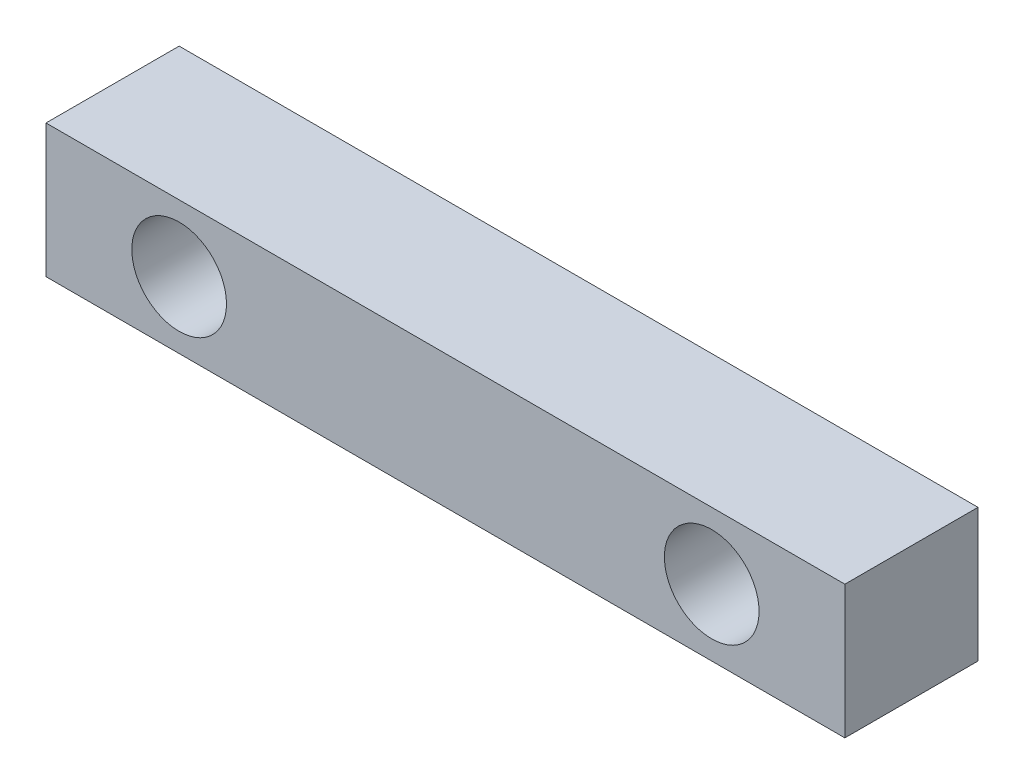
ISO-10303-21;
HEADER;
FILE_DESCRIPTION(('STEP AP214'),'2;1');
FILE_NAME('part.step','',(''),(''),'','','');
FILE_SCHEMA(('AUTOMOTIVE_DESIGN { 1 0 10303 214 1 1 1 1 }'));
ENDSEC;
DATA;
#1=APPLICATION_CONTEXT('core data for automotive mechanical design processes');
#2=APPLICATION_PROTOCOL_DEFINITION('international standard','automotive_design',2000,#1);
#3=PRODUCT_CONTEXT('',#1,'mechanical');
#4=PRODUCT('Part','Part','',(#3));
#5=PRODUCT_RELATED_PRODUCT_CATEGORY('part','',(#4));
#6=PRODUCT_DEFINITION_FORMATION('','',#4);
#7=PRODUCT_DEFINITION_CONTEXT('part definition',#1,'design');
#8=PRODUCT_DEFINITION('design','',#6,#7);
#9=PRODUCT_DEFINITION_SHAPE('','',#8);
#10=(LENGTH_UNIT() NAMED_UNIT(*) SI_UNIT(.MILLI.,.METRE.));
#11=(NAMED_UNIT(*) PLANE_ANGLE_UNIT() SI_UNIT($,.RADIAN.));
#12=(NAMED_UNIT(*) SI_UNIT($,.STERADIAN.) SOLID_ANGLE_UNIT());
#13=UNCERTAINTY_MEASURE_WITH_UNIT(LENGTH_MEASURE(1.E-05),#10,'distance_accuracy_value','');
#14=(GEOMETRIC_REPRESENTATION_CONTEXT(3) GLOBAL_UNCERTAINTY_ASSIGNED_CONTEXT((#13)) GLOBAL_UNIT_ASSIGNED_CONTEXT((#10,
#11,#12)) REPRESENTATION_CONTEXT('',''));
#15=CARTESIAN_POINT('',(0.,0.,0.));
#16=DIRECTION('',(0.,0.,1.));
#17=DIRECTION('',(1.,0.,0.));
#18=AXIS2_PLACEMENT_3D('',#15,#16,#17);
#19=CARTESIAN_POINT('',(-15.,2.5,5.));
#20=DIRECTION('',(1.,0.,0.));
#21=DIRECTION('',(0.,0.,-1.));
#22=AXIS2_PLACEMENT_3D('',#19,#20,#21);
#23=PLANE('',#22);
#24=DIRECTION('',(0.,-1.,0.));
#25=VECTOR('',#24,1.);
#26=CARTESIAN_POINT('',(-15.,2.5,0.));
#27=LINE('',#26,#25);
#28=CARTESIAN_POINT('',(-15.,2.5,0.));
#29=VERTEX_POINT('',#28);
#30=CARTESIAN_POINT('',(-15.,-2.5,0.));
#31=VERTEX_POINT('',#30);
#32=EDGE_CURVE('E107',#29,#31,#27,.T.);
#33=ORIENTED_EDGE('',*,*,#32,.T.);
#34=DIRECTION('',(0.,0.,-1.));
#35=VECTOR('',#34,1.);
#36=CARTESIAN_POINT('',(-15.,-2.5,5.));
#37=LINE('',#36,#35);
#38=CARTESIAN_POINT('',(-15.,-2.5,5.));
#39=VERTEX_POINT('',#38);
#40=EDGE_CURVE('E11',#39,#31,#37,.T.);
#41=ORIENTED_EDGE('',*,*,#40,.F.);
#42=DIRECTION('',(0.,-1.,0.));
#43=VECTOR('',#42,1.);
#44=CARTESIAN_POINT('',(-15.,2.5,5.));
#45=LINE('',#44,#43);
#46=CARTESIAN_POINT('',(-15.,2.5,5.));
#47=VERTEX_POINT('',#46);
#48=EDGE_CURVE('E91',#47,#39,#45,.T.);
#49=ORIENTED_EDGE('',*,*,#48,.F.);
#50=DIRECTION('',(0.,0.,-1.));
#51=VECTOR('',#50,1.);
#52=CARTESIAN_POINT('',(-15.,2.5,5.));
#53=LINE('',#52,#51);
#54=EDGE_CURVE('E103',#47,#29,#53,.T.);
#55=ORIENTED_EDGE('',*,*,#54,.T.);
#56=EDGE_LOOP('',(#33,#41,#49,#55));
#57=FACE_BOUND('',#56,.T.);
#58=ADVANCED_FACE('F39',(#57),#23,.F.);
#59=CARTESIAN_POINT('',(-15.,-2.5,5.));
#60=DIRECTION('',(0.,1.,0.));
#61=DIRECTION('',(-1.,0.,0.));
#62=AXIS2_PLACEMENT_3D('',#59,#60,#61);
#63=PLANE('',#62);
#64=DIRECTION('',(1.,0.,0.));
#65=VECTOR('',#64,1.);
#66=CARTESIAN_POINT('',(-15.,-2.5,0.));
#67=LINE('',#66,#65);
#68=CARTESIAN_POINT('',(15.,-2.50000000000001,0.));
#69=VERTEX_POINT('',#68);
#70=EDGE_CURVE('E96',#31,#69,#67,.T.);
#71=ORIENTED_EDGE('',*,*,#70,.T.);
#72=DIRECTION('',(0.,0.,-1.));
#73=VECTOR('',#72,1.);
#74=CARTESIAN_POINT('',(15.,-2.50000000000001,5.));
#75=LINE('',#74,#73);
#76=CARTESIAN_POINT('',(15.,-2.50000000000001,5.));
#77=VERTEX_POINT('',#76);
#78=EDGE_CURVE('E48',#77,#69,#75,.T.);
#79=ORIENTED_EDGE('',*,*,#78,.F.);
#80=DIRECTION('',(1.,0.,0.));
#81=VECTOR('',#80,1.);
#82=CARTESIAN_POINT('',(-15.,-2.5,5.));
#83=LINE('',#82,#81);
#84=EDGE_CURVE('E86',#39,#77,#83,.T.);
#85=ORIENTED_EDGE('',*,*,#84,.F.);
#86=ORIENTED_EDGE('',*,*,#40,.T.);
#87=EDGE_LOOP('',(#71,#79,#85,#86));
#88=FACE_BOUND('',#87,.T.);
#89=ADVANCED_FACE('F95',(#88),#63,.F.);
#90=CARTESIAN_POINT('',(15.,2.50000000000001,5.));
#91=DIRECTION('',(-1.,0.,0.));
#92=DIRECTION('',(0.,0.,1.));
#93=AXIS2_PLACEMENT_3D('',#90,#91,#92);
#94=PLANE('',#93);
#95=DIRECTION('',(0.,1.,0.));
#96=VECTOR('',#95,1.);
#97=CARTESIAN_POINT('',(15.,2.50000000000001,0.));
#98=LINE('',#97,#96);
#99=CARTESIAN_POINT('',(15.,2.50000000000001,0.));
#100=VERTEX_POINT('',#99);
#101=EDGE_CURVE('E73',#69,#100,#98,.T.);
#102=ORIENTED_EDGE('',*,*,#101,.T.);
#103=DIRECTION('',(0.,0.,-1.));
#104=VECTOR('',#103,1.);
#105=CARTESIAN_POINT('',(15.,2.50000000000001,5.));
#106=LINE('',#105,#104);
#107=CARTESIAN_POINT('',(15.,2.50000000000001,5.));
#108=VERTEX_POINT('',#107);
#109=EDGE_CURVE('E98',#108,#100,#106,.T.);
#110=ORIENTED_EDGE('',*,*,#109,.F.);
#111=DIRECTION('',(0.,1.,0.));
#112=VECTOR('',#111,1.);
#113=CARTESIAN_POINT('',(15.,2.50000000000001,5.));
#114=LINE('',#113,#112);
#115=EDGE_CURVE('E89',#77,#108,#114,.T.);
#116=ORIENTED_EDGE('',*,*,#115,.F.);
#117=ORIENTED_EDGE('',*,*,#78,.T.);
#118=EDGE_LOOP('',(#102,#110,#116,#117));
#119=FACE_BOUND('',#118,.T.);
#120=ADVANCED_FACE('F99',(#119),#94,.F.);
#121=CARTESIAN_POINT('',(-15.,2.5,5.));
#122=DIRECTION('',(0.,-1.,0.));
#123=DIRECTION('',(1.,0.,0.));
#124=AXIS2_PLACEMENT_3D('',#121,#122,#123);
#125=PLANE('',#124);
#126=DIRECTION('',(-1.,0.,0.));
#127=VECTOR('',#126,1.);
#128=CARTESIAN_POINT('',(-15.,2.5,0.));
#129=LINE('',#128,#127);
#130=EDGE_CURVE('E79',#100,#29,#129,.T.);
#131=ORIENTED_EDGE('',*,*,#130,.T.);
#132=ORIENTED_EDGE('',*,*,#54,.F.);
#133=DIRECTION('',(-1.,0.,0.));
#134=VECTOR('',#133,1.);
#135=CARTESIAN_POINT('',(-15.,2.5,5.));
#136=LINE('',#135,#134);
#137=EDGE_CURVE('E56',#108,#47,#136,.T.);
#138=ORIENTED_EDGE('',*,*,#137,.F.);
#139=ORIENTED_EDGE('',*,*,#109,.T.);
#140=EDGE_LOOP('',(#131,#132,#138,#139));
#141=FACE_BOUND('',#140,.T.);
#142=ADVANCED_FACE('F121',(#141),#125,.F.);
#143=CARTESIAN_POINT('',(0.,0.,5.));
#144=DIRECTION('',(0.,0.,1.));
#145=DIRECTION('',(1.,0.,0.));
#146=AXIS2_PLACEMENT_3D('',#143,#144,#145);
#147=PLANE('',#146);
#148=CARTESIAN_POINT('',(-10.,0.,5.));
#149=DIRECTION('',(0.,0.,1.));
#150=DIRECTION('',(1.,0.,0.));
#151=AXIS2_PLACEMENT_3D('',#148,#149,#150);
#152=CIRCLE('',#151,1.778);
#153=CARTESIAN_POINT('',(-8.222,0.,5.));
#154=VERTEX_POINT('',#153);
#155=EDGE_CURVE('E139',#154,#154,#152,.T.);
#156=ORIENTED_EDGE('',*,*,#155,.F.);
#157=EDGE_LOOP('',(#156));
#158=FACE_BOUND('',#157,.T.);
#159=CARTESIAN_POINT('',(10.,0.,5.));
#160=DIRECTION('',(0.,0.,1.));
#161=DIRECTION('',(1.,0.,0.));
#162=AXIS2_PLACEMENT_3D('',#159,#160,#161);
#163=CIRCLE('',#162,1.778);
#164=CARTESIAN_POINT('',(11.778,0.,5.));
#165=VERTEX_POINT('',#164);
#166=EDGE_CURVE('E131',#165,#165,#163,.T.);
#167=ORIENTED_EDGE('',*,*,#166,.F.);
#168=EDGE_LOOP('',(#167));
#169=FACE_BOUND('',#168,.T.);
#170=ORIENTED_EDGE('',*,*,#48,.T.);
#171=ORIENTED_EDGE('',*,*,#84,.T.);
#172=ORIENTED_EDGE('',*,*,#115,.T.);
#173=ORIENTED_EDGE('',*,*,#137,.T.);
#174=EDGE_LOOP('',(#170,#171,#172,#173));
#175=FACE_BOUND('',#174,.T.);
#176=ADVANCED_FACE('F87',(#158,#169,#175),#147,.T.);
#177=CARTESIAN_POINT('',(0.,0.,0.));
#178=DIRECTION('',(0.,0.,1.));
#179=DIRECTION('',(1.,0.,0.));
#180=AXIS2_PLACEMENT_3D('',#177,#178,#179);
#181=PLANE('',#180);
#182=CARTESIAN_POINT('',(-10.,0.,0.));
#183=DIRECTION('',(0.,0.,1.));
#184=DIRECTION('',(1.,0.,0.));
#185=AXIS2_PLACEMENT_3D('',#182,#183,#184);
#186=CIRCLE('',#185,1.778);
#187=CARTESIAN_POINT('',(-8.222,0.,0.));
#188=VERTEX_POINT('',#187);
#189=EDGE_CURVE('E135',#188,#188,#186,.T.);
#190=ORIENTED_EDGE('',*,*,#189,.T.);
#191=EDGE_LOOP('',(#190));
#192=FACE_BOUND('',#191,.T.);
#193=CARTESIAN_POINT('',(10.,0.,0.));
#194=DIRECTION('',(0.,0.,1.));
#195=DIRECTION('',(1.,0.,0.));
#196=AXIS2_PLACEMENT_3D('',#193,#194,#195);
#197=CIRCLE('',#196,1.778);
#198=CARTESIAN_POINT('',(11.778,0.,0.));
#199=VERTEX_POINT('',#198);
#200=EDGE_CURVE('E111',#199,#199,#197,.T.);
#201=ORIENTED_EDGE('',*,*,#200,.T.);
#202=EDGE_LOOP('',(#201));
#203=FACE_BOUND('',#202,.T.);
#204=ORIENTED_EDGE('',*,*,#32,.F.);
#205=ORIENTED_EDGE('',*,*,#130,.F.);
#206=ORIENTED_EDGE('',*,*,#101,.F.);
#207=ORIENTED_EDGE('',*,*,#70,.F.);
#208=EDGE_LOOP('',(#204,#205,#206,#207));
#209=FACE_BOUND('',#208,.T.);
#210=ADVANCED_FACE('F124',(#192,#203,#209),#181,.F.);
#211=CARTESIAN_POINT('',(10.,0.,5.));
#212=DIRECTION('',(0.,0.,1.));
#213=DIRECTION('',(1.,0.,0.));
#214=AXIS2_PLACEMENT_3D('',#211,#212,#213);
#215=CYLINDRICAL_SURFACE('',#214,1.778);
#216=ORIENTED_EDGE('',*,*,#200,.F.);
#217=EDGE_LOOP('',(#216));
#218=FACE_BOUND('',#217,.T.);
#219=ORIENTED_EDGE('',*,*,#166,.T.);
#220=EDGE_LOOP('',(#219));
#221=FACE_BOUND('',#220,.T.);
#222=ADVANCED_FACE('F151',(#218,#221),#215,.F.);
#223=CARTESIAN_POINT('',(-10.,0.,5.));
#224=DIRECTION('',(0.,0.,1.));
#225=DIRECTION('',(1.,0.,0.));
#226=AXIS2_PLACEMENT_3D('',#223,#224,#225);
#227=CYLINDRICAL_SURFACE('',#226,1.778);
#228=ORIENTED_EDGE('',*,*,#189,.F.);
#229=EDGE_LOOP('',(#228));
#230=FACE_BOUND('',#229,.T.);
#231=ORIENTED_EDGE('',*,*,#155,.T.);
#232=EDGE_LOOP('',(#231));
#233=FACE_BOUND('',#232,.T.);
#234=ADVANCED_FACE('F144',(#230,#233),#227,.F.);
#235=CLOSED_SHELL('',(#58,#89,#120,#142,#176,#210,#222,#234));
#236=MANIFOLD_SOLID_BREP('B2',#235);
#237=ADVANCED_BREP_SHAPE_REPRESENTATION('',(#18,#236),#14);
#238=SHAPE_DEFINITION_REPRESENTATION(#9,#237);
ENDSEC;
END-ISO-10303-21;
